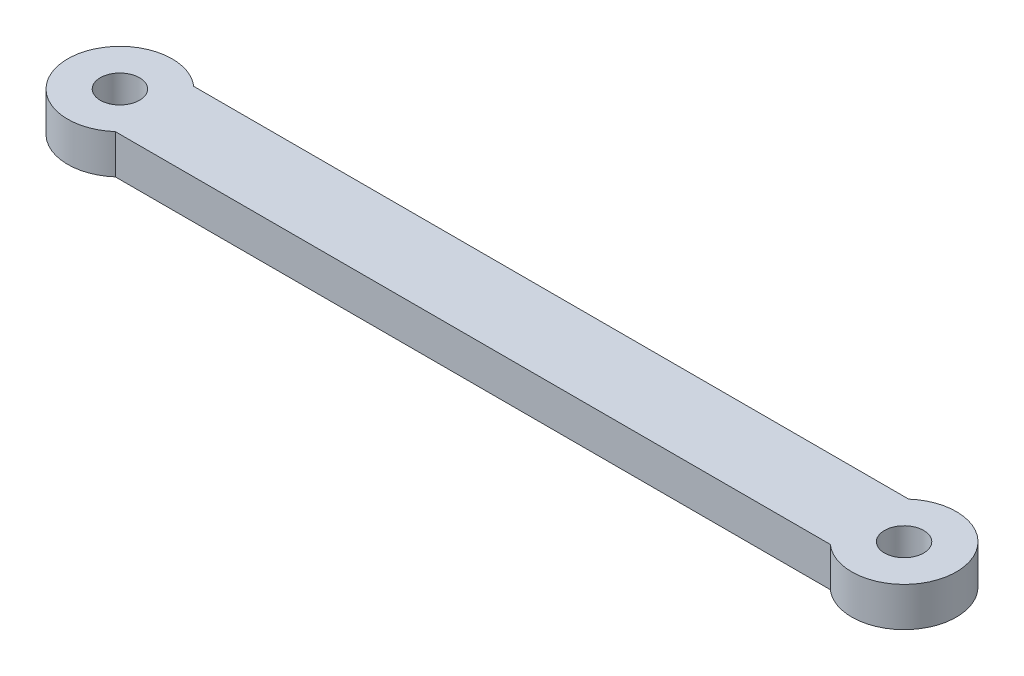
ISO-10303-21;
HEADER;
FILE_DESCRIPTION(('STEP AP214'),'2;1');
FILE_NAME('part.step','',(''),(''),'','','');
FILE_SCHEMA(('AUTOMOTIVE_DESIGN { 1 0 10303 214 1 1 1 1 }'));
ENDSEC;
DATA;
#1=APPLICATION_CONTEXT('core data for automotive mechanical design processes');
#2=APPLICATION_PROTOCOL_DEFINITION('international standard','automotive_design',2000,#1);
#3=PRODUCT_CONTEXT('',#1,'mechanical');
#4=PRODUCT('Part','Part','',(#3));
#5=PRODUCT_RELATED_PRODUCT_CATEGORY('part','',(#4));
#6=PRODUCT_DEFINITION_FORMATION('','',#4);
#7=PRODUCT_DEFINITION_CONTEXT('part definition',#1,'design');
#8=PRODUCT_DEFINITION('design','',#6,#7);
#9=PRODUCT_DEFINITION_SHAPE('','',#8);
#10=(LENGTH_UNIT() NAMED_UNIT(*) SI_UNIT(.MILLI.,.METRE.));
#11=(NAMED_UNIT(*) PLANE_ANGLE_UNIT() SI_UNIT($,.RADIAN.));
#12=(NAMED_UNIT(*) SI_UNIT($,.STERADIAN.) SOLID_ANGLE_UNIT());
#13=UNCERTAINTY_MEASURE_WITH_UNIT(LENGTH_MEASURE(1.E-05),#10,'distance_accuracy_value','');
#14=(GEOMETRIC_REPRESENTATION_CONTEXT(3) GLOBAL_UNCERTAINTY_ASSIGNED_CONTEXT((#13)) GLOBAL_UNIT_ASSIGNED_CONTEXT((#10,
#11,#12)) REPRESENTATION_CONTEXT('',''));
#15=CARTESIAN_POINT('',(0.,0.,0.));
#16=DIRECTION('',(0.,0.,1.));
#17=DIRECTION('',(1.,0.,0.));
#18=AXIS2_PLACEMENT_3D('',#15,#16,#17);
#19=CARTESIAN_POINT('',(30.,3.,0.));
#20=DIRECTION('',(0.,-1.,0.));
#21=DIRECTION('',(0.,0.,-1.));
#22=AXIS2_PLACEMENT_3D('',#19,#20,#21);
#23=PLANE('',#22);
#24=CARTESIAN_POINT('',(30.,3.,0.));
#25=DIRECTION('',(0.,1.,0.));
#26=DIRECTION('',(0.,0.,-1.));
#27=AXIS2_PLACEMENT_3D('',#24,#25,#26);
#28=CIRCLE('',#27,4.);
#29=CARTESIAN_POINT('',(27.3542486889354,3.,3.));
#30=VERTEX_POINT('',#29);
#31=CARTESIAN_POINT('',(27.3542486889354,3.,-3.));
#32=VERTEX_POINT('',#31);
#33=EDGE_CURVE('E90',#30,#32,#28,.T.);
#34=ORIENTED_EDGE('',*,*,#33,.T.);
#35=DIRECTION('',(-1.,0.,0.));
#36=VECTOR('',#35,1.);
#37=CARTESIAN_POINT('',(-27.3542486889354,3.,-3.));
#38=LINE('',#37,#36);
#39=CARTESIAN_POINT('',(-27.3542486889354,3.,-3.));
#40=VERTEX_POINT('',#39);
#41=EDGE_CURVE('E85',#32,#40,#38,.T.);
#42=ORIENTED_EDGE('',*,*,#41,.T.);
#43=CARTESIAN_POINT('',(-30.,3.,0.));
#44=DIRECTION('',(0.,1.,0.));
#45=DIRECTION('',(0.,0.,1.));
#46=AXIS2_PLACEMENT_3D('',#43,#44,#45);
#47=CIRCLE('',#46,4.);
#48=CARTESIAN_POINT('',(-27.3542486889354,3.,3.));
#49=VERTEX_POINT('',#48);
#50=EDGE_CURVE('E88',#40,#49,#47,.T.);
#51=ORIENTED_EDGE('',*,*,#50,.T.);
#52=DIRECTION('',(1.,0.,0.));
#53=VECTOR('',#52,1.);
#54=CARTESIAN_POINT('',(27.3542486889354,3.,3.));
#55=LINE('',#54,#53);
#56=EDGE_CURVE('E55',#49,#30,#55,.T.);
#57=ORIENTED_EDGE('',*,*,#56,.T.);
#58=EDGE_LOOP('',(#34,#42,#51,#57));
#59=FACE_BOUND('',#58,.T.);
#60=CARTESIAN_POINT('',(-30.,3.,0.));
#61=DIRECTION('',(0.,1.,0.));
#62=DIRECTION('',(0.,0.,1.));
#63=AXIS2_PLACEMENT_3D('',#60,#61,#62);
#64=CIRCLE('',#63,1.5);
#65=CARTESIAN_POINT('',(-30.,3.,1.5));
#66=VERTEX_POINT('',#65);
#67=EDGE_CURVE('E105',#66,#66,#64,.T.);
#68=ORIENTED_EDGE('',*,*,#67,.F.);
#69=EDGE_LOOP('',(#68));
#70=FACE_BOUND('',#69,.T.);
#71=CARTESIAN_POINT('',(30.,3.,0.));
#72=DIRECTION('',(0.,1.,0.));
#73=DIRECTION('',(0.,0.,-1.));
#74=AXIS2_PLACEMENT_3D('',#71,#72,#73);
#75=CIRCLE('',#74,1.5);
#76=CARTESIAN_POINT('',(30.,3.,-1.50000000000001));
#77=VERTEX_POINT('',#76);
#78=EDGE_CURVE('E120',#77,#77,#75,.T.);
#79=ORIENTED_EDGE('',*,*,#78,.F.);
#80=EDGE_LOOP('',(#79));
#81=FACE_BOUND('',#80,.T.);
#82=ADVANCED_FACE('F38',(#59,#70,#81),#23,.F.);
#83=CARTESIAN_POINT('',(30.,0.,0.));
#84=DIRECTION('',(0.,-1.,0.));
#85=DIRECTION('',(0.,0.,-1.));
#86=AXIS2_PLACEMENT_3D('',#83,#84,#85);
#87=PLANE('',#86);
#88=CARTESIAN_POINT('',(-30.,0.,0.));
#89=DIRECTION('',(0.,1.,0.));
#90=DIRECTION('',(0.,0.,1.));
#91=AXIS2_PLACEMENT_3D('',#88,#89,#90);
#92=CIRCLE('',#91,1.5);
#93=CARTESIAN_POINT('',(-30.,0.,1.5));
#94=VERTEX_POINT('',#93);
#95=EDGE_CURVE('E117',#94,#94,#92,.T.);
#96=ORIENTED_EDGE('',*,*,#95,.T.);
#97=EDGE_LOOP('',(#96));
#98=FACE_BOUND('',#97,.T.);
#99=CARTESIAN_POINT('',(30.,0.,0.));
#100=DIRECTION('',(0.,1.,0.));
#101=DIRECTION('',(0.,0.,-1.));
#102=AXIS2_PLACEMENT_3D('',#99,#100,#101);
#103=CIRCLE('',#102,4.);
#104=CARTESIAN_POINT('',(27.3542486889354,0.,3.));
#105=VERTEX_POINT('',#104);
#106=CARTESIAN_POINT('',(27.3542486889354,0.,-3.));
#107=VERTEX_POINT('',#106);
#108=EDGE_CURVE('E102',#105,#107,#103,.T.);
#109=ORIENTED_EDGE('',*,*,#108,.F.);
#110=DIRECTION('',(1.,0.,0.));
#111=VECTOR('',#110,1.);
#112=CARTESIAN_POINT('',(27.3542486889354,0.,3.));
#113=LINE('',#112,#111);
#114=CARTESIAN_POINT('',(-27.3542486889354,0.,3.));
#115=VERTEX_POINT('',#114);
#116=EDGE_CURVE('E78',#115,#105,#113,.T.);
#117=ORIENTED_EDGE('',*,*,#116,.F.);
#118=CARTESIAN_POINT('',(-30.,0.,0.));
#119=DIRECTION('',(0.,1.,0.));
#120=DIRECTION('',(0.,0.,1.));
#121=AXIS2_PLACEMENT_3D('',#118,#119,#120);
#122=CIRCLE('',#121,4.);
#123=CARTESIAN_POINT('',(-27.3542486889354,0.,-3.));
#124=VERTEX_POINT('',#123);
#125=EDGE_CURVE('E72',#124,#115,#122,.T.);
#126=ORIENTED_EDGE('',*,*,#125,.F.);
#127=DIRECTION('',(-1.,0.,0.));
#128=VECTOR('',#127,1.);
#129=CARTESIAN_POINT('',(-27.3542486889354,0.,-3.));
#130=LINE('',#129,#128);
#131=EDGE_CURVE('E94',#107,#124,#130,.T.);
#132=ORIENTED_EDGE('',*,*,#131,.F.);
#133=EDGE_LOOP('',(#109,#117,#126,#132));
#134=FACE_BOUND('',#133,.T.);
#135=CARTESIAN_POINT('',(30.,0.,0.));
#136=DIRECTION('',(0.,1.,0.));
#137=DIRECTION('',(0.,0.,-1.));
#138=AXIS2_PLACEMENT_3D('',#135,#136,#137);
#139=CIRCLE('',#138,1.5);
#140=CARTESIAN_POINT('',(30.,0.,-1.50000000000001));
#141=VERTEX_POINT('',#140);
#142=EDGE_CURVE('E123',#141,#141,#139,.T.);
#143=ORIENTED_EDGE('',*,*,#142,.T.);
#144=EDGE_LOOP('',(#143));
#145=FACE_BOUND('',#144,.T.);
#146=ADVANCED_FACE('F113',(#98,#134,#145),#87,.T.);
#147=CARTESIAN_POINT('',(30.,3.,0.));
#148=DIRECTION('',(0.,-1.,0.));
#149=DIRECTION('',(0.,0.,-1.));
#150=AXIS2_PLACEMENT_3D('',#147,#148,#149);
#151=CYLINDRICAL_SURFACE('',#150,4.);
#152=ORIENTED_EDGE('',*,*,#108,.T.);
#153=DIRECTION('',(0.,-1.,0.));
#154=VECTOR('',#153,1.);
#155=CARTESIAN_POINT('',(27.3542486889354,3.,-3.));
#156=LINE('',#155,#154);
#157=EDGE_CURVE('E11',#32,#107,#156,.T.);
#158=ORIENTED_EDGE('',*,*,#157,.F.);
#159=ORIENTED_EDGE('',*,*,#33,.F.);
#160=DIRECTION('',(0.,-1.,0.));
#161=VECTOR('',#160,1.);
#162=CARTESIAN_POINT('',(27.3542486889354,3.,3.));
#163=LINE('',#162,#161);
#164=EDGE_CURVE('E98',#30,#105,#163,.T.);
#165=ORIENTED_EDGE('',*,*,#164,.T.);
#166=EDGE_LOOP('',(#152,#158,#159,#165));
#167=FACE_BOUND('',#166,.T.);
#168=ADVANCED_FACE('F40',(#167),#151,.T.);
#169=CARTESIAN_POINT('',(-27.3542486889354,3.,-3.));
#170=DIRECTION('',(0.,0.,1.));
#171=DIRECTION('',(1.,0.,0.));
#172=AXIS2_PLACEMENT_3D('',#169,#170,#171);
#173=PLANE('',#172);
#174=ORIENTED_EDGE('',*,*,#131,.T.);
#175=DIRECTION('',(0.,-1.,0.));
#176=VECTOR('',#175,1.);
#177=CARTESIAN_POINT('',(-27.3542486889354,3.,-3.));
#178=LINE('',#177,#176);
#179=EDGE_CURVE('E47',#40,#124,#178,.T.);
#180=ORIENTED_EDGE('',*,*,#179,.F.);
#181=ORIENTED_EDGE('',*,*,#41,.F.);
#182=ORIENTED_EDGE('',*,*,#157,.T.);
#183=EDGE_LOOP('',(#174,#180,#181,#182));
#184=FACE_BOUND('',#183,.T.);
#185=ADVANCED_FACE('F93',(#184),#173,.F.);
#186=CARTESIAN_POINT('',(-30.,3.,0.));
#187=DIRECTION('',(0.,-1.,0.));
#188=DIRECTION('',(0.,0.,-1.));
#189=AXIS2_PLACEMENT_3D('',#186,#187,#188);
#190=CYLINDRICAL_SURFACE('',#189,4.);
#191=ORIENTED_EDGE('',*,*,#125,.T.);
#192=DIRECTION('',(0.,-1.,0.));
#193=VECTOR('',#192,1.);
#194=CARTESIAN_POINT('',(-27.3542486889354,3.,3.));
#195=LINE('',#194,#193);
#196=EDGE_CURVE('E95',#49,#115,#195,.T.);
#197=ORIENTED_EDGE('',*,*,#196,.F.);
#198=ORIENTED_EDGE('',*,*,#50,.F.);
#199=ORIENTED_EDGE('',*,*,#179,.T.);
#200=EDGE_LOOP('',(#191,#197,#198,#199));
#201=FACE_BOUND('',#200,.T.);
#202=ADVANCED_FACE('F96',(#201),#190,.T.);
#203=CARTESIAN_POINT('',(27.3542486889354,3.,3.));
#204=DIRECTION('',(0.,0.,-1.));
#205=DIRECTION('',(-1.,0.,0.));
#206=AXIS2_PLACEMENT_3D('',#203,#204,#205);
#207=PLANE('',#206);
#208=ORIENTED_EDGE('',*,*,#116,.T.);
#209=ORIENTED_EDGE('',*,*,#164,.F.);
#210=ORIENTED_EDGE('',*,*,#56,.F.);
#211=ORIENTED_EDGE('',*,*,#196,.T.);
#212=EDGE_LOOP('',(#208,#209,#210,#211));
#213=FACE_BOUND('',#212,.T.);
#214=ADVANCED_FACE('F110',(#213),#207,.F.);
#215=CARTESIAN_POINT('',(-30.,3.,0.));
#216=DIRECTION('',(0.,-1.,0.));
#217=DIRECTION('',(0.,0.,-1.));
#218=AXIS2_PLACEMENT_3D('',#215,#216,#217);
#219=CYLINDRICAL_SURFACE('',#218,1.5);
#220=ORIENTED_EDGE('',*,*,#67,.T.);
#221=EDGE_LOOP('',(#220));
#222=FACE_BOUND('',#221,.T.);
#223=ORIENTED_EDGE('',*,*,#95,.F.);
#224=EDGE_LOOP('',(#223));
#225=FACE_BOUND('',#224,.T.);
#226=ADVANCED_FACE('F140',(#222,#225),#219,.F.);
#227=CARTESIAN_POINT('',(30.,3.,0.));
#228=DIRECTION('',(0.,-1.,0.));
#229=DIRECTION('',(0.,0.,-1.));
#230=AXIS2_PLACEMENT_3D('',#227,#228,#229);
#231=CYLINDRICAL_SURFACE('',#230,1.5);
#232=ORIENTED_EDGE('',*,*,#78,.T.);
#233=EDGE_LOOP('',(#232));
#234=FACE_BOUND('',#233,.T.);
#235=ORIENTED_EDGE('',*,*,#142,.F.);
#236=EDGE_LOOP('',(#235));
#237=FACE_BOUND('',#236,.T.);
#238=ADVANCED_FACE('F129',(#234,#237),#231,.F.);
#239=CLOSED_SHELL('',(#82,#146,#168,#185,#202,#214,#226,#238));
#240=MANIFOLD_SOLID_BREP('B2',#239);
#241=ADVANCED_BREP_SHAPE_REPRESENTATION('',(#18,#240),#14);
#242=SHAPE_DEFINITION_REPRESENTATION(#9,#241);
ENDSEC;
END-ISO-10303-21;
